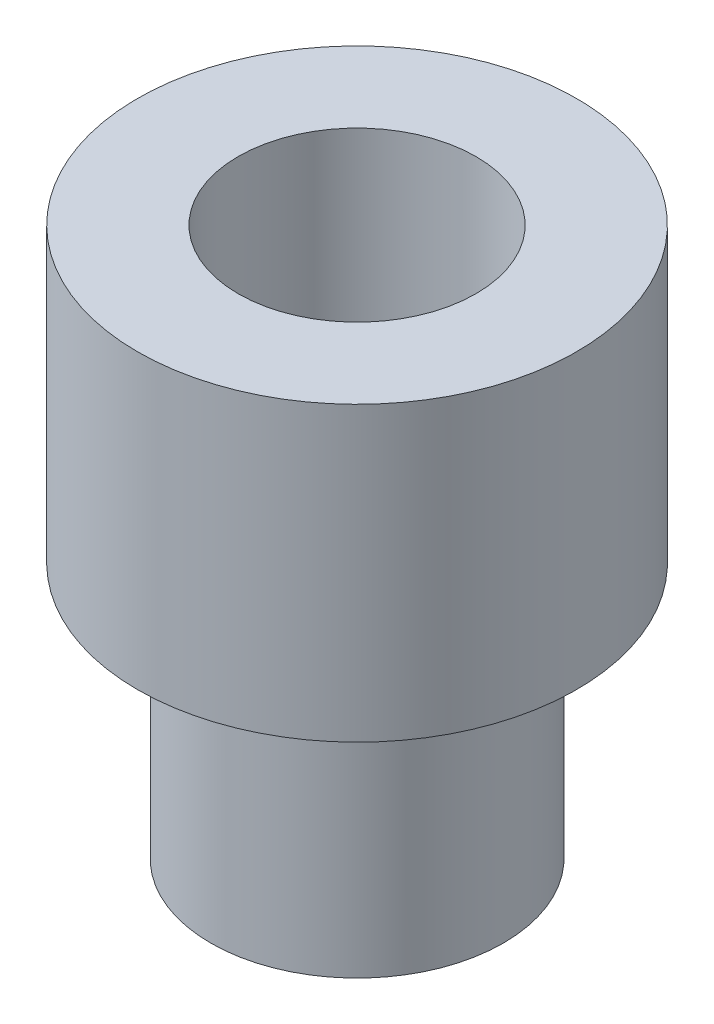
ISO-10303-21;
HEADER;
FILE_DESCRIPTION(('STEP AP214'),'2;1');
FILE_NAME('part.step','',(''),(''),'','','');
FILE_SCHEMA(('AUTOMOTIVE_DESIGN { 1 0 10303 214 1 1 1 1 }'));
ENDSEC;
DATA;
#1=APPLICATION_CONTEXT('core data for automotive mechanical design processes');
#2=APPLICATION_PROTOCOL_DEFINITION('international standard','automotive_design',2000,#1);
#3=PRODUCT_CONTEXT('',#1,'mechanical');
#4=PRODUCT('Part','Part','',(#3));
#5=PRODUCT_RELATED_PRODUCT_CATEGORY('part','',(#4));
#6=PRODUCT_DEFINITION_FORMATION('','',#4);
#7=PRODUCT_DEFINITION_CONTEXT('part definition',#1,'design');
#8=PRODUCT_DEFINITION('design','',#6,#7);
#9=PRODUCT_DEFINITION_SHAPE('','',#8);
#10=(LENGTH_UNIT() NAMED_UNIT(*) SI_UNIT(.MILLI.,.METRE.));
#11=(NAMED_UNIT(*) PLANE_ANGLE_UNIT() SI_UNIT($,.RADIAN.));
#12=(NAMED_UNIT(*) SI_UNIT($,.STERADIAN.) SOLID_ANGLE_UNIT());
#13=UNCERTAINTY_MEASURE_WITH_UNIT(LENGTH_MEASURE(1.E-05),#10,'distance_accuracy_value','');
#14=(GEOMETRIC_REPRESENTATION_CONTEXT(3) GLOBAL_UNCERTAINTY_ASSIGNED_CONTEXT((#13)) GLOBAL_UNIT_ASSIGNED_CONTEXT((#10,
#11,#12)) REPRESENTATION_CONTEXT('',''));
#15=CARTESIAN_POINT('',(0.,0.,0.));
#16=DIRECTION('',(0.,0.,1.));
#17=DIRECTION('',(1.,0.,0.));
#18=AXIS2_PLACEMENT_3D('',#15,#16,#17);
#19=CARTESIAN_POINT('',(0.,0.,0.));
#20=DIRECTION('',(0.,1.,0.));
#21=DIRECTION('',(0.,0.,1.));
#22=AXIS2_PLACEMENT_3D('',#19,#20,#21);
#23=PLANE('',#22);
#24=CARTESIAN_POINT('',(0.,0.,0.));
#25=DIRECTION('',(0.,1.,0.));
#26=DIRECTION('',(0.,0.,1.));
#27=AXIS2_PLACEMENT_3D('',#24,#25,#26);
#28=CIRCLE('',#27,6.);
#29=CARTESIAN_POINT('',(0.,0.,6.));
#30=VERTEX_POINT('',#29);
#31=EDGE_CURVE('E50',#30,#30,#28,.T.);
#32=ORIENTED_EDGE('',*,*,#31,.F.);
#33=EDGE_LOOP('',(#32));
#34=FACE_BOUND('',#33,.T.);
#35=CARTESIAN_POINT('',(0.,0.,0.));
#36=DIRECTION('',(0.,1.,0.));
#37=DIRECTION('',(0.,0.,1.));
#38=AXIS2_PLACEMENT_3D('',#35,#36,#37);
#39=CIRCLE('',#38,4.);
#40=CARTESIAN_POINT('',(0.,0.,4.));
#41=VERTEX_POINT('',#40);
#42=EDGE_CURVE('E10',#41,#41,#39,.F.);
#43=ORIENTED_EDGE('',*,*,#42,.F.);
#44=EDGE_LOOP('',(#43));
#45=FACE_BOUND('',#44,.T.);
#46=ADVANCED_FACE('F39',(#34,#45),#23,.F.);
#47=CARTESIAN_POINT('',(0.,8.,0.));
#48=DIRECTION('',(0.,1.,0.));
#49=DIRECTION('',(0.,0.,1.));
#50=AXIS2_PLACEMENT_3D('',#47,#48,#49);
#51=PLANE('',#50);
#52=CARTESIAN_POINT('',(0.,8.,0.));
#53=DIRECTION('',(0.,1.,0.));
#54=DIRECTION('',(0.,0.,1.));
#55=AXIS2_PLACEMENT_3D('',#52,#53,#54);
#56=CIRCLE('',#55,6.);
#57=CARTESIAN_POINT('',(0.,8.,6.));
#58=VERTEX_POINT('',#57);
#59=EDGE_CURVE('E46',#58,#58,#56,.T.);
#60=ORIENTED_EDGE('',*,*,#59,.T.);
#61=EDGE_LOOP('',(#60));
#62=FACE_BOUND('',#61,.T.);
#63=CARTESIAN_POINT('',(0.,8.,0.));
#64=DIRECTION('',(0.,1.,0.));
#65=DIRECTION('',(0.,0.,1.));
#66=AXIS2_PLACEMENT_3D('',#63,#64,#65);
#67=CIRCLE('',#66,3.25);
#68=CARTESIAN_POINT('',(0.,8.,3.25));
#69=VERTEX_POINT('',#68);
#70=EDGE_CURVE('E55',#69,#69,#67,.T.);
#71=ORIENTED_EDGE('',*,*,#70,.F.);
#72=EDGE_LOOP('',(#71));
#73=FACE_BOUND('',#72,.T.);
#74=ADVANCED_FACE('F82',(#62,#73),#51,.T.);
#75=CARTESIAN_POINT('',(0.,8.,0.));
#76=DIRECTION('',(0.,-1.,0.));
#77=DIRECTION('',(0.,0.,-1.));
#78=AXIS2_PLACEMENT_3D('',#75,#76,#77);
#79=CYLINDRICAL_SURFACE('',#78,6.);
#80=ORIENTED_EDGE('',*,*,#59,.F.);
#81=EDGE_LOOP('',(#80));
#82=FACE_BOUND('',#81,.T.);
#83=ORIENTED_EDGE('',*,*,#31,.T.);
#84=EDGE_LOOP('',(#83));
#85=FACE_BOUND('',#84,.T.);
#86=ADVANCED_FACE('F41',(#82,#85),#79,.T.);
#87=CARTESIAN_POINT('',(0.,8.,0.));
#88=DIRECTION('',(0.,-1.,0.));
#89=DIRECTION('',(0.,0.,-1.));
#90=AXIS2_PLACEMENT_3D('',#87,#88,#89);
#91=CYLINDRICAL_SURFACE('',#90,3.25);
#92=ORIENTED_EDGE('',*,*,#70,.T.);
#93=EDGE_LOOP('',(#92));
#94=FACE_BOUND('',#93,.T.);
#95=CARTESIAN_POINT('',(0.,-7.,0.));
#96=DIRECTION('',(0.,-1.,0.));
#97=DIRECTION('',(0.,0.,-1.));
#98=AXIS2_PLACEMENT_3D('',#95,#96,#97);
#99=CIRCLE('',#98,3.25);
#100=CARTESIAN_POINT('',(0.,-7.,-3.25));
#101=VERTEX_POINT('',#100);
#102=EDGE_CURVE('E62',#101,#101,#99,.T.);
#103=ORIENTED_EDGE('',*,*,#102,.T.);
#104=EDGE_LOOP('',(#103));
#105=FACE_BOUND('',#104,.T.);
#106=ADVANCED_FACE('F66',(#94,#105),#91,.F.);
#107=CARTESIAN_POINT('',(0.,-7.,0.));
#108=DIRECTION('',(0.,-1.,0.));
#109=DIRECTION('',(0.,0.,-1.));
#110=AXIS2_PLACEMENT_3D('',#107,#108,#109);
#111=PLANE('',#110);
#112=CARTESIAN_POINT('',(0.,-7.,0.));
#113=DIRECTION('',(0.,-1.,0.));
#114=DIRECTION('',(0.,0.,-1.));
#115=AXIS2_PLACEMENT_3D('',#112,#113,#114);
#116=CIRCLE('',#115,4.);
#117=CARTESIAN_POINT('',(0.,-7.,-4.));
#118=VERTEX_POINT('',#117);
#119=EDGE_CURVE('E59',#118,#118,#116,.T.);
#120=ORIENTED_EDGE('',*,*,#119,.T.);
#121=EDGE_LOOP('',(#120));
#122=FACE_BOUND('',#121,.T.);
#123=ORIENTED_EDGE('',*,*,#102,.F.);
#124=EDGE_LOOP('',(#123));
#125=FACE_BOUND('',#124,.T.);
#126=ADVANCED_FACE('F68',(#122,#125),#111,.T.);
#127=CARTESIAN_POINT('',(0.,-7.,0.));
#128=DIRECTION('',(0.,1.,0.));
#129=DIRECTION('',(0.,0.,1.));
#130=AXIS2_PLACEMENT_3D('',#127,#128,#129);
#131=CYLINDRICAL_SURFACE('',#130,4.);
#132=ORIENTED_EDGE('',*,*,#119,.F.);
#133=EDGE_LOOP('',(#132));
#134=FACE_BOUND('',#133,.T.);
#135=ORIENTED_EDGE('',*,*,#42,.T.);
#136=EDGE_LOOP('',(#135));
#137=FACE_BOUND('',#136,.T.);
#138=ADVANCED_FACE('F70',(#134,#137),#131,.T.);
#139=CLOSED_SHELL('',(#46,#74,#86,#106,#126,#138));
#140=MANIFOLD_SOLID_BREP('B2',#139);
#141=ADVANCED_BREP_SHAPE_REPRESENTATION('',(#18,#140),#14);
#142=SHAPE_DEFINITION_REPRESENTATION(#9,#141);
ENDSEC;
END-ISO-10303-21;
